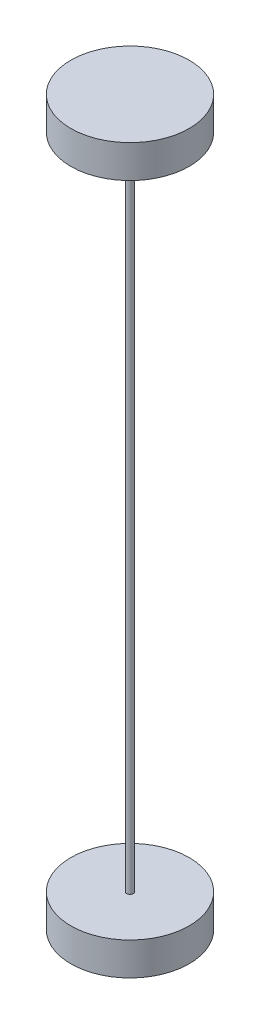
ISO-10303-21;
HEADER;
FILE_DESCRIPTION(('STEP AP214'),'2;1');
FILE_NAME('part.step','',(''),(''),'','','');
FILE_SCHEMA(('AUTOMOTIVE_DESIGN { 1 0 10303 214 1 1 1 1 }'));
ENDSEC;
DATA;
#1=APPLICATION_CONTEXT('core data for automotive mechanical design processes');
#2=APPLICATION_PROTOCOL_DEFINITION('international standard','automotive_design',2000,#1);
#3=PRODUCT_CONTEXT('',#1,'mechanical');
#4=PRODUCT('Part','Part','',(#3));
#5=PRODUCT_RELATED_PRODUCT_CATEGORY('part','',(#4));
#6=PRODUCT_DEFINITION_FORMATION('','',#4);
#7=PRODUCT_DEFINITION_CONTEXT('part definition',#1,'design');
#8=PRODUCT_DEFINITION('design','',#6,#7);
#9=PRODUCT_DEFINITION_SHAPE('','',#8);
#10=(LENGTH_UNIT() NAMED_UNIT(*) SI_UNIT(.MILLI.,.METRE.));
#11=(NAMED_UNIT(*) PLANE_ANGLE_UNIT() SI_UNIT($,.RADIAN.));
#12=(NAMED_UNIT(*) SI_UNIT($,.STERADIAN.) SOLID_ANGLE_UNIT());
#13=UNCERTAINTY_MEASURE_WITH_UNIT(LENGTH_MEASURE(1.E-05),#10,'distance_accuracy_value','');
#14=(GEOMETRIC_REPRESENTATION_CONTEXT(3) GLOBAL_UNCERTAINTY_ASSIGNED_CONTEXT((#13)) GLOBAL_UNIT_ASSIGNED_CONTEXT((#10,
#11,#12)) REPRESENTATION_CONTEXT('',''));
#15=CARTESIAN_POINT('',(0.,0.,0.));
#16=DIRECTION('',(0.,0.,1.));
#17=DIRECTION('',(1.,0.,0.));
#18=AXIS2_PLACEMENT_3D('',#15,#16,#17);
#19=CARTESIAN_POINT('',(0.,10.,0.));
#20=DIRECTION('',(0.,-1.,0.));
#21=DIRECTION('',(0.,0.,-1.));
#22=AXIS2_PLACEMENT_3D('',#19,#20,#21);
#23=CYLINDRICAL_SURFACE('',#22,18.);
#24=CARTESIAN_POINT('',(0.,10.,0.));
#25=DIRECTION('',(0.,1.,0.));
#26=DIRECTION('',(0.,0.,1.));
#27=AXIS2_PLACEMENT_3D('',#24,#25,#26);
#28=CIRCLE('',#27,18.);
#29=CARTESIAN_POINT('',(0.,10.,18.));
#30=VERTEX_POINT('',#29);
#31=EDGE_CURVE('E40',#30,#30,#28,.T.);
#32=ORIENTED_EDGE('',*,*,#31,.F.);
#33=EDGE_LOOP('',(#32));
#34=FACE_BOUND('',#33,.T.);
#35=CARTESIAN_POINT('',(0.,0.,0.));
#36=DIRECTION('',(0.,1.,0.));
#37=DIRECTION('',(0.,0.,1.));
#38=AXIS2_PLACEMENT_3D('',#35,#36,#37);
#39=CIRCLE('',#38,18.);
#40=CARTESIAN_POINT('',(0.,0.,18.));
#41=VERTEX_POINT('',#40);
#42=EDGE_CURVE('E44',#41,#41,#39,.T.);
#43=ORIENTED_EDGE('',*,*,#42,.T.);
#44=EDGE_LOOP('',(#43));
#45=FACE_BOUND('',#44,.T.);
#46=ADVANCED_FACE('F34',(#34,#45),#23,.T.);
#47=CARTESIAN_POINT('',(0.,10.,0.));
#48=DIRECTION('',(0.,1.,0.));
#49=DIRECTION('',(0.,0.,1.));
#50=AXIS2_PLACEMENT_3D('',#47,#48,#49);
#51=PLANE('',#50);
#52=ORIENTED_EDGE('',*,*,#31,.T.);
#53=EDGE_LOOP('',(#52));
#54=FACE_BOUND('',#53,.T.);
#55=ADVANCED_FACE('F78',(#54),#51,.T.);
#56=CARTESIAN_POINT('',(0.,0.,0.));
#57=DIRECTION('',(0.,1.,0.));
#58=DIRECTION('',(0.,0.,1.));
#59=AXIS2_PLACEMENT_3D('',#56,#57,#58);
#60=PLANE('',#59);
#61=CARTESIAN_POINT('',(0.,0.,0.));
#62=DIRECTION('',(0.,1.,0.));
#63=DIRECTION('',(0.,0.,1.));
#64=AXIS2_PLACEMENT_3D('',#61,#62,#63);
#65=CIRCLE('',#64,1.);
#66=CARTESIAN_POINT('',(0.,0.,1.));
#67=VERTEX_POINT('',#66);
#68=EDGE_CURVE('E10',#67,#67,#65,.F.);
#69=ORIENTED_EDGE('',*,*,#68,.F.);
#70=EDGE_LOOP('',(#69));
#71=FACE_BOUND('',#70,.T.);
#72=ORIENTED_EDGE('',*,*,#42,.F.);
#73=EDGE_LOOP('',(#72));
#74=FACE_BOUND('',#73,.T.);
#75=ADVANCED_FACE('F83',(#71,#74),#60,.F.);
#76=CARTESIAN_POINT('',(0.,-200.,0.));
#77=DIRECTION('',(0.,1.,0.));
#78=DIRECTION('',(0.,0.,1.));
#79=AXIS2_PLACEMENT_3D('',#76,#77,#78);
#80=CYLINDRICAL_SURFACE('',#79,1.);
#81=CARTESIAN_POINT('',(0.,-200.,0.));
#82=DIRECTION('',(0.,-1.,0.));
#83=DIRECTION('',(0.,0.,-1.));
#84=AXIS2_PLACEMENT_3D('',#81,#82,#83);
#85=CIRCLE('',#84,1.);
#86=CARTESIAN_POINT('',(0.,-200.,-1.));
#87=VERTEX_POINT('',#86);
#88=EDGE_CURVE('E49',#87,#87,#85,.T.);
#89=ORIENTED_EDGE('',*,*,#88,.F.);
#90=EDGE_LOOP('',(#89));
#91=FACE_BOUND('',#90,.T.);
#92=ORIENTED_EDGE('',*,*,#68,.T.);
#93=EDGE_LOOP('',(#92));
#94=FACE_BOUND('',#93,.T.);
#95=ADVANCED_FACE('F65',(#91,#94),#80,.T.);
#96=CARTESIAN_POINT('',(0.,-210.,0.));
#97=DIRECTION('',(0.,1.,0.));
#98=DIRECTION('',(0.,0.,1.));
#99=AXIS2_PLACEMENT_3D('',#96,#97,#98);
#100=CYLINDRICAL_SURFACE('',#99,18.);
#101=CARTESIAN_POINT('',(0.,-210.,0.));
#102=DIRECTION('',(0.,-1.,0.));
#103=DIRECTION('',(0.,0.,-1.));
#104=AXIS2_PLACEMENT_3D('',#101,#102,#103);
#105=CIRCLE('',#104,18.);
#106=CARTESIAN_POINT('',(0.,-210.,-18.));
#107=VERTEX_POINT('',#106);
#108=EDGE_CURVE('E53',#107,#107,#105,.T.);
#109=ORIENTED_EDGE('',*,*,#108,.F.);
#110=EDGE_LOOP('',(#109));
#111=FACE_BOUND('',#110,.T.);
#112=CARTESIAN_POINT('',(0.,-200.,0.));
#113=DIRECTION('',(0.,-1.,0.));
#114=DIRECTION('',(0.,0.,-1.));
#115=AXIS2_PLACEMENT_3D('',#112,#113,#114);
#116=CIRCLE('',#115,18.);
#117=CARTESIAN_POINT('',(0.,-200.,-18.));
#118=VERTEX_POINT('',#117);
#119=EDGE_CURVE('E54',#118,#118,#116,.T.);
#120=ORIENTED_EDGE('',*,*,#119,.T.);
#121=EDGE_LOOP('',(#120));
#122=FACE_BOUND('',#121,.T.);
#123=ADVANCED_FACE('F62',(#111,#122),#100,.T.);
#124=CARTESIAN_POINT('',(0.,-210.,0.));
#125=DIRECTION('',(0.,-1.,0.));
#126=DIRECTION('',(0.,0.,-1.));
#127=AXIS2_PLACEMENT_3D('',#124,#125,#126);
#128=PLANE('',#127);
#129=ORIENTED_EDGE('',*,*,#108,.T.);
#130=EDGE_LOOP('',(#129));
#131=FACE_BOUND('',#130,.T.);
#132=ADVANCED_FACE('F60',(#131),#128,.T.);
#133=CARTESIAN_POINT('',(0.,-200.,0.));
#134=DIRECTION('',(0.,-1.,0.));
#135=DIRECTION('',(0.,0.,-1.));
#136=AXIS2_PLACEMENT_3D('',#133,#134,#135);
#137=PLANE('',#136);
#138=ORIENTED_EDGE('',*,*,#88,.T.);
#139=EDGE_LOOP('',(#138));
#140=FACE_BOUND('',#139,.T.);
#141=ORIENTED_EDGE('',*,*,#119,.F.);
#142=EDGE_LOOP('',(#141));
#143=FACE_BOUND('',#142,.T.);
#144=ADVANCED_FACE('F69',(#140,#143),#137,.F.);
#145=CLOSED_SHELL('',(#46,#55,#75,#95,#123,#132,#144));
#146=MANIFOLD_SOLID_BREP('B2',#145);
#147=ADVANCED_BREP_SHAPE_REPRESENTATION('',(#18,#146),#14);
#148=SHAPE_DEFINITION_REPRESENTATION(#9,#147);
ENDSEC;
END-ISO-10303-21;
